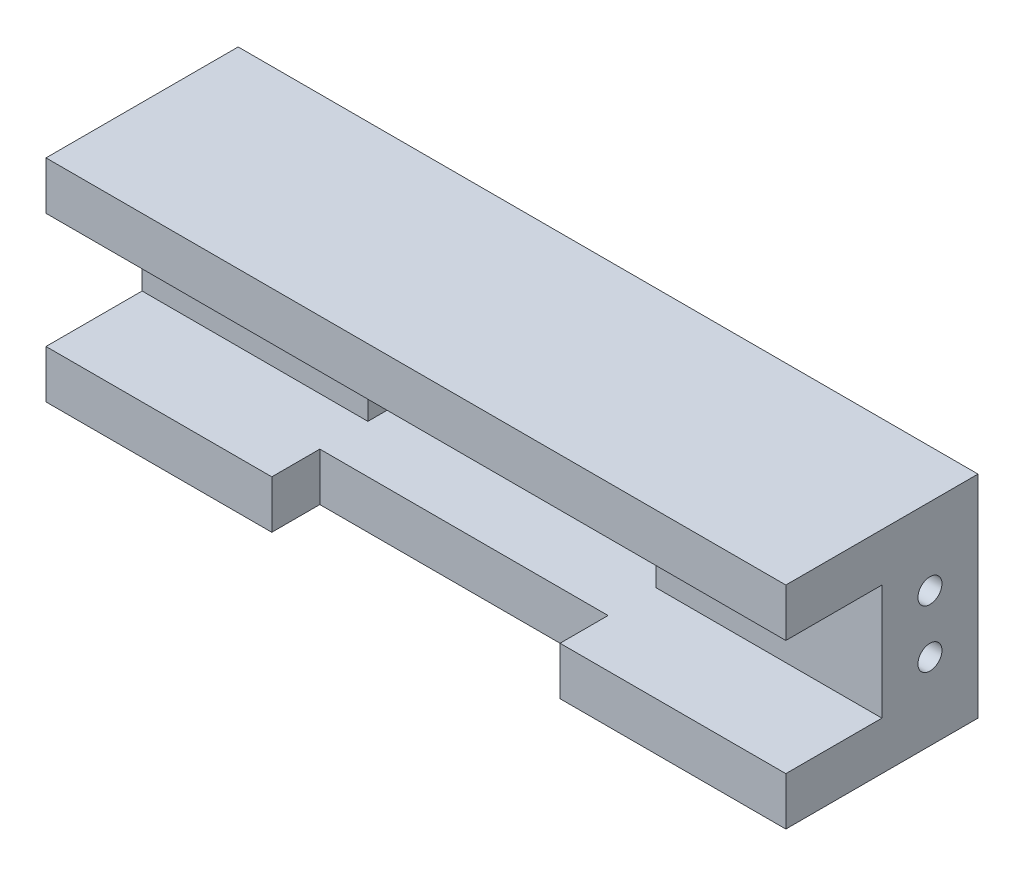
ISO-10303-21;
HEADER;
FILE_DESCRIPTION(('STEP AP214'),'2;1');
FILE_NAME('part.step','',(''),(''),'','','');
FILE_SCHEMA(('AUTOMOTIVE_DESIGN { 1 0 10303 214 1 1 1 1 }'));
ENDSEC;
DATA;
#1=APPLICATION_CONTEXT('core data for automotive mechanical design processes');
#2=APPLICATION_PROTOCOL_DEFINITION('international standard','automotive_design',2000,#1);
#3=PRODUCT_CONTEXT('',#1,'mechanical');
#4=PRODUCT('Part','Part','',(#3));
#5=PRODUCT_RELATED_PRODUCT_CATEGORY('part','',(#4));
#6=PRODUCT_DEFINITION_FORMATION('','',#4);
#7=PRODUCT_DEFINITION_CONTEXT('part definition',#1,'design');
#8=PRODUCT_DEFINITION('design','',#6,#7);
#9=PRODUCT_DEFINITION_SHAPE('','',#8);
#10=(LENGTH_UNIT() NAMED_UNIT(*) SI_UNIT(.MILLI.,.METRE.));
#11=(NAMED_UNIT(*) PLANE_ANGLE_UNIT() SI_UNIT($,.RADIAN.));
#12=(NAMED_UNIT(*) SI_UNIT($,.STERADIAN.) SOLID_ANGLE_UNIT());
#13=UNCERTAINTY_MEASURE_WITH_UNIT(LENGTH_MEASURE(1.E-05),#10,'distance_accuracy_value','');
#14=(GEOMETRIC_REPRESENTATION_CONTEXT(3) GLOBAL_UNCERTAINTY_ASSIGNED_CONTEXT((#13)) GLOBAL_UNIT_ASSIGNED_CONTEXT((#10,
#11,#12)) REPRESENTATION_CONTEXT('',''));
#15=CARTESIAN_POINT('',(0.,0.,0.));
#16=DIRECTION('',(0.,0.,1.));
#17=DIRECTION('',(1.,0.,0.));
#18=AXIS2_PLACEMENT_3D('',#15,#16,#17);
#19=CARTESIAN_POINT('',(0.,0.,0.));
#20=DIRECTION('',(0.,1.,0.));
#21=DIRECTION('',(1.,0.,0.));
#22=AXIS2_PLACEMENT_3D('',#19,#20,#21);
#23=PLANE('',#22);
#24=DIRECTION('',(1.,0.,0.));
#25=VECTOR('',#24,1.);
#26=CARTESIAN_POINT('',(77.,0.,20.));
#27=LINE('',#26,#25);
#28=CARTESIAN_POINT('',(0.,0.,20.));
#29=VERTEX_POINT('',#28);
#30=CARTESIAN_POINT('',(23.5,0.,20.));
#31=VERTEX_POINT('',#30);
#32=EDGE_CURVE('E217',#29,#31,#27,.T.);
#33=ORIENTED_EDGE('',*,*,#32,.T.);
#34=DIRECTION('',(0.,0.,1.));
#35=VECTOR('',#34,1.);
#36=CARTESIAN_POINT('',(23.5,0.,15.));
#37=LINE('',#36,#35);
#38=CARTESIAN_POINT('',(23.5,0.,15.));
#39=VERTEX_POINT('',#38);
#40=EDGE_CURVE('E170',#39,#31,#37,.T.);
#41=ORIENTED_EDGE('',*,*,#40,.F.);
#42=DIRECTION('',(-1.,0.,0.));
#43=VECTOR('',#42,1.);
#44=CARTESIAN_POINT('',(0.,0.,15.));
#45=LINE('',#44,#43);
#46=CARTESIAN_POINT('',(53.5,0.,15.));
#47=VERTEX_POINT('',#46);
#48=EDGE_CURVE('E156',#47,#39,#45,.T.);
#49=ORIENTED_EDGE('',*,*,#48,.F.);
#50=DIRECTION('',(0.,0.,1.));
#51=VECTOR('',#50,1.);
#52=CARTESIAN_POINT('',(53.5,0.,15.));
#53=LINE('',#52,#51);
#54=CARTESIAN_POINT('',(53.5,0.,20.));
#55=VERTEX_POINT('',#54);
#56=EDGE_CURVE('E154',#47,#55,#53,.T.);
#57=ORIENTED_EDGE('',*,*,#56,.T.);
#58=CARTESIAN_POINT('',(77.,0.,20.));
#59=VERTEX_POINT('',#58);
#60=EDGE_CURVE('E216',#55,#59,#27,.T.);
#61=ORIENTED_EDGE('',*,*,#60,.T.);
#62=DIRECTION('',(0.,0.,-1.));
#63=VECTOR('',#62,1.);
#64=CARTESIAN_POINT('',(77.,0.,0.));
#65=LINE('',#64,#63);
#66=CARTESIAN_POINT('',(77.,0.,10.));
#67=VERTEX_POINT('',#66);
#68=EDGE_CURVE('E194',#59,#67,#65,.T.);
#69=ORIENTED_EDGE('',*,*,#68,.T.);
#70=DIRECTION('',(1.,0.,0.));
#71=VECTOR('',#70,1.);
#72=CARTESIAN_POINT('',(0.,0.,10.));
#73=LINE('',#72,#71);
#74=CARTESIAN_POINT('',(53.5,0.,10.));
#75=VERTEX_POINT('',#74);
#76=EDGE_CURVE('E277',#75,#67,#73,.T.);
#77=ORIENTED_EDGE('',*,*,#76,.F.);
#78=DIRECTION('',(0.,0.,-1.));
#79=VECTOR('',#78,1.);
#80=CARTESIAN_POINT('',(53.5,0.,10.));
#81=LINE('',#80,#79);
#82=CARTESIAN_POINT('',(53.5,0.,0.));
#83=VERTEX_POINT('',#82);
#84=EDGE_CURVE('E195',#75,#83,#81,.T.);
#85=ORIENTED_EDGE('',*,*,#84,.T.);
#86=DIRECTION('',(-1.,0.,0.));
#87=VECTOR('',#86,1.);
#88=CARTESIAN_POINT('',(0.,0.,0.));
#89=LINE('',#88,#87);
#90=CARTESIAN_POINT('',(23.5,0.,0.));
#91=VERTEX_POINT('',#90);
#92=EDGE_CURVE('E179',#83,#91,#89,.T.);
#93=ORIENTED_EDGE('',*,*,#92,.T.);
#94=DIRECTION('',(0.,0.,-1.));
#95=VECTOR('',#94,1.);
#96=CARTESIAN_POINT('',(23.5,0.,10.));
#97=LINE('',#96,#95);
#98=CARTESIAN_POINT('',(23.5,0.,10.));
#99=VERTEX_POINT('',#98);
#100=EDGE_CURVE('E192',#99,#91,#97,.T.);
#101=ORIENTED_EDGE('',*,*,#100,.F.);
#102=CARTESIAN_POINT('',(0.,0.,10.));
#103=VERTEX_POINT('',#102);
#104=EDGE_CURVE('E278',#103,#99,#73,.T.);
#105=ORIENTED_EDGE('',*,*,#104,.F.);
#106=DIRECTION('',(0.,0.,1.));
#107=VECTOR('',#106,1.);
#108=CARTESIAN_POINT('',(0.,0.,0.));
#109=LINE('',#108,#107);
#110=EDGE_CURVE('E203',#103,#29,#109,.T.);
#111=ORIENTED_EDGE('',*,*,#110,.T.);
#112=EDGE_LOOP('',(#33,#41,#49,#57,#61,#69,#77,#85,#93,#101,#105,#111));
#113=FACE_BOUND('',#112,.T.);
#114=ADVANCED_FACE('F33',(#113),#23,.T.);
#115=CARTESIAN_POINT('',(77.,-5.,20.));
#116=DIRECTION('',(0.,0.,1.));
#117=DIRECTION('',(1.,0.,0.));
#118=AXIS2_PLACEMENT_3D('',#115,#116,#117);
#119=PLANE('',#118);
#120=DIRECTION('',(1.,0.,0.));
#121=VECTOR('',#120,1.);
#122=CARTESIAN_POINT('',(77.,-5.,20.));
#123=LINE('',#122,#121);
#124=CARTESIAN_POINT('',(0.,-5.,20.));
#125=VERTEX_POINT('',#124);
#126=CARTESIAN_POINT('',(23.5,-5.,20.));
#127=VERTEX_POINT('',#126);
#128=EDGE_CURVE('E204',#125,#127,#123,.T.);
#129=ORIENTED_EDGE('',*,*,#128,.T.);
#130=DIRECTION('',(0.,1.,0.));
#131=VECTOR('',#130,1.);
#132=CARTESIAN_POINT('',(23.5,0.,20.));
#133=LINE('',#132,#131);
#134=EDGE_CURVE('E319',#127,#31,#133,.T.);
#135=ORIENTED_EDGE('',*,*,#134,.T.);
#136=ORIENTED_EDGE('',*,*,#32,.F.);
#137=DIRECTION('',(0.,1.,0.));
#138=VECTOR('',#137,1.);
#139=CARTESIAN_POINT('',(0.,-5.,20.));
#140=LINE('',#139,#138);
#141=EDGE_CURVE('E213',#125,#29,#140,.T.);
#142=ORIENTED_EDGE('',*,*,#141,.F.);
#143=EDGE_LOOP('',(#129,#135,#136,#142));
#144=FACE_BOUND('',#143,.T.);
#145=ADVANCED_FACE('F330',(#144),#119,.T.);
#146=CARTESIAN_POINT('',(0.,-5.,0.));
#147=DIRECTION('',(0.,1.,0.));
#148=DIRECTION('',(1.,0.,0.));
#149=AXIS2_PLACEMENT_3D('',#146,#147,#148);
#150=PLANE('',#149);
#151=DIRECTION('',(0.,0.,1.));
#152=VECTOR('',#151,1.);
#153=CARTESIAN_POINT('',(23.5,-5.,15.));
#154=LINE('',#153,#152);
#155=CARTESIAN_POINT('',(23.5,-5.,15.));
#156=VERTEX_POINT('',#155);
#157=EDGE_CURVE('E168',#156,#127,#154,.T.);
#158=ORIENTED_EDGE('',*,*,#157,.T.);
#159=ORIENTED_EDGE('',*,*,#128,.F.);
#160=DIRECTION('',(0.,0.,1.));
#161=VECTOR('',#160,1.);
#162=CARTESIAN_POINT('',(0.,-5.,0.));
#163=LINE('',#162,#161);
#164=CARTESIAN_POINT('',(0.,-5.,0.));
#165=VERTEX_POINT('',#164);
#166=EDGE_CURVE('E207',#165,#125,#163,.T.);
#167=ORIENTED_EDGE('',*,*,#166,.F.);
#168=DIRECTION('',(-1.,0.,0.));
#169=VECTOR('',#168,1.);
#170=CARTESIAN_POINT('',(77.,-5.,0.));
#171=LINE('',#170,#169);
#172=CARTESIAN_POINT('',(77.,-5.,0.));
#173=VERTEX_POINT('',#172);
#174=EDGE_CURVE('E210',#173,#165,#171,.T.);
#175=ORIENTED_EDGE('',*,*,#174,.F.);
#176=DIRECTION('',(0.,0.,-1.));
#177=VECTOR('',#176,1.);
#178=CARTESIAN_POINT('',(77.,-5.,0.));
#179=LINE('',#178,#177);
#180=CARTESIAN_POINT('',(77.,-5.,20.));
#181=VERTEX_POINT('',#180);
#182=EDGE_CURVE('E200',#181,#173,#179,.T.);
#183=ORIENTED_EDGE('',*,*,#182,.F.);
#184=CARTESIAN_POINT('',(53.5,-5.,20.));
#185=VERTEX_POINT('',#184);
#186=EDGE_CURVE('E167',#185,#181,#123,.T.);
#187=ORIENTED_EDGE('',*,*,#186,.F.);
#188=DIRECTION('',(0.,0.,1.));
#189=VECTOR('',#188,1.);
#190=CARTESIAN_POINT('',(53.5,-5.,15.));
#191=LINE('',#190,#189);
#192=CARTESIAN_POINT('',(53.5,-5.,15.));
#193=VERTEX_POINT('',#192);
#194=EDGE_CURVE('E151',#193,#185,#191,.T.);
#195=ORIENTED_EDGE('',*,*,#194,.F.);
#196=DIRECTION('',(1.,0.,0.));
#197=VECTOR('',#196,1.);
#198=CARTESIAN_POINT('',(0.,-5.,15.));
#199=LINE('',#198,#197);
#200=EDGE_CURVE('E157',#156,#193,#199,.T.);
#201=ORIENTED_EDGE('',*,*,#200,.F.);
#202=EDGE_LOOP('',(#158,#159,#167,#175,#183,#187,#195,#201));
#203=FACE_BOUND('',#202,.T.);
#204=ADVANCED_FACE('F165',(#203),#150,.F.);
#205=CARTESIAN_POINT('',(0.,0.,10.));
#206=DIRECTION('',(0.,0.,-1.));
#207=DIRECTION('',(-1.,0.,0.));
#208=AXIS2_PLACEMENT_3D('',#205,#206,#207);
#209=PLANE('',#208);
#210=DIRECTION('',(0.,-1.,0.));
#211=VECTOR('',#210,1.);
#212=CARTESIAN_POINT('',(23.5,0.,10.));
#213=LINE('',#212,#211);
#214=CARTESIAN_POINT('',(23.5,12.,10.));
#215=VERTEX_POINT('',#214);
#216=EDGE_CURVE('E175',#215,#99,#213,.T.);
#217=ORIENTED_EDGE('',*,*,#216,.F.);
#218=DIRECTION('',(-1.,0.,0.));
#219=VECTOR('',#218,1.);
#220=CARTESIAN_POINT('',(0.,12.,10.));
#221=LINE('',#220,#219);
#222=CARTESIAN_POINT('',(0.,12.,10.));
#223=VERTEX_POINT('',#222);
#224=EDGE_CURVE('E42',#215,#223,#221,.T.);
#225=ORIENTED_EDGE('',*,*,#224,.T.);
#226=DIRECTION('',(0.,-1.,0.));
#227=VECTOR('',#226,1.);
#228=CARTESIAN_POINT('',(0.,0.,10.));
#229=LINE('',#228,#227);
#230=EDGE_CURVE('E274',#223,#103,#229,.T.);
#231=ORIENTED_EDGE('',*,*,#230,.T.);
#232=ORIENTED_EDGE('',*,*,#104,.T.);
#233=EDGE_LOOP('',(#217,#225,#231,#232));
#234=FACE_BOUND('',#233,.T.);
#235=ADVANCED_FACE('F341',(#234),#209,.F.);
#236=CARTESIAN_POINT('',(0.,0.,0.));
#237=DIRECTION('',(0.,0.,-1.));
#238=DIRECTION('',(-1.,0.,0.));
#239=AXIS2_PLACEMENT_3D('',#236,#237,#238);
#240=PLANE('',#239);
#241=DIRECTION('',(0.,-1.,0.));
#242=VECTOR('',#241,1.);
#243=CARTESIAN_POINT('',(0.,0.,0.));
#244=LINE('',#243,#242);
#245=CARTESIAN_POINT('',(0.,17.,0.));
#246=VERTEX_POINT('',#245);
#247=EDGE_CURVE('E265',#246,#165,#244,.T.);
#248=ORIENTED_EDGE('',*,*,#247,.F.);
#249=DIRECTION('',(-1.,0.,0.));
#250=VECTOR('',#249,1.);
#251=CARTESIAN_POINT('',(77.,17.,0.));
#252=LINE('',#251,#250);
#253=CARTESIAN_POINT('',(77.,17.,0.));
#254=VERTEX_POINT('',#253);
#255=EDGE_CURVE('E230',#254,#246,#252,.T.);
#256=ORIENTED_EDGE('',*,*,#255,.F.);
#257=DIRECTION('',(0.,1.,0.));
#258=VECTOR('',#257,1.);
#259=CARTESIAN_POINT('',(77.,0.,0.));
#260=LINE('',#259,#258);
#261=EDGE_CURVE('E37',#173,#254,#260,.T.);
#262=ORIENTED_EDGE('',*,*,#261,.F.);
#263=ORIENTED_EDGE('',*,*,#174,.T.);
#264=EDGE_LOOP('',(#248,#256,#262,#263));
#265=FACE_BOUND('',#264,.T.);
#266=DIRECTION('',(-1.,0.,0.));
#267=VECTOR('',#266,1.);
#268=CARTESIAN_POINT('',(0.,12.,0.));
#269=LINE('',#268,#267);
#270=CARTESIAN_POINT('',(53.5,12.,0.));
#271=VERTEX_POINT('',#270);
#272=CARTESIAN_POINT('',(23.5,12.,0.));
#273=VERTEX_POINT('',#272);
#274=EDGE_CURVE('E184',#271,#273,#269,.T.);
#275=ORIENTED_EDGE('',*,*,#274,.T.);
#276=DIRECTION('',(0.,-1.,0.));
#277=VECTOR('',#276,1.);
#278=CARTESIAN_POINT('',(23.5,0.,0.));
#279=LINE('',#278,#277);
#280=EDGE_CURVE('E58',#273,#91,#279,.T.);
#281=ORIENTED_EDGE('',*,*,#280,.T.);
#282=ORIENTED_EDGE('',*,*,#92,.F.);
#283=DIRECTION('',(0.,-1.,0.));
#284=VECTOR('',#283,1.);
#285=CARTESIAN_POINT('',(53.5,0.,0.));
#286=LINE('',#285,#284);
#287=EDGE_CURVE('E187',#271,#83,#286,.T.);
#288=ORIENTED_EDGE('',*,*,#287,.F.);
#289=EDGE_LOOP('',(#275,#281,#282,#288));
#290=FACE_BOUND('',#289,.T.);
#291=ADVANCED_FACE('F293',(#265,#290),#240,.T.);
#292=CARTESIAN_POINT('',(0.,0.,10.));
#293=DIRECTION('',(1.,0.,0.));
#294=DIRECTION('',(0.,0.,-1.));
#295=AXIS2_PLACEMENT_3D('',#292,#293,#294);
#296=PLANE('',#295);
#297=CARTESIAN_POINT('',(0.,3.,5.));
#298=DIRECTION('',(1.,0.,0.));
#299=DIRECTION('',(0.,0.,-1.));
#300=AXIS2_PLACEMENT_3D('',#297,#298,#299);
#301=CIRCLE('',#300,1.25);
#302=CARTESIAN_POINT('',(0.,3.,3.75));
#303=VERTEX_POINT('',#302);
#304=EDGE_CURVE('E254',#303,#303,#301,.T.);
#305=ORIENTED_EDGE('',*,*,#304,.T.);
#306=EDGE_LOOP('',(#305));
#307=FACE_BOUND('',#306,.T.);
#308=CARTESIAN_POINT('',(0.,9.,5.));
#309=DIRECTION('',(1.,0.,0.));
#310=DIRECTION('',(0.,0.,-1.));
#311=AXIS2_PLACEMENT_3D('',#308,#309,#310);
#312=CIRCLE('',#311,1.25);
#313=CARTESIAN_POINT('',(0.,9.,3.75));
#314=VERTEX_POINT('',#313);
#315=EDGE_CURVE('E249',#314,#314,#312,.T.);
#316=ORIENTED_EDGE('',*,*,#315,.T.);
#317=EDGE_LOOP('',(#316));
#318=FACE_BOUND('',#317,.T.);
#319=ORIENTED_EDGE('',*,*,#247,.T.);
#320=ORIENTED_EDGE('',*,*,#166,.T.);
#321=ORIENTED_EDGE('',*,*,#141,.T.);
#322=ORIENTED_EDGE('',*,*,#110,.F.);
#323=ORIENTED_EDGE('',*,*,#230,.F.);
#324=DIRECTION('',(0.,0.,1.));
#325=VECTOR('',#324,1.);
#326=CARTESIAN_POINT('',(0.,12.,0.));
#327=LINE('',#326,#325);
#328=CARTESIAN_POINT('',(0.,12.,20.));
#329=VERTEX_POINT('',#328);
#330=EDGE_CURVE('E241',#223,#329,#327,.T.);
#331=ORIENTED_EDGE('',*,*,#330,.T.);
#332=DIRECTION('',(0.,-1.,0.));
#333=VECTOR('',#332,1.);
#334=CARTESIAN_POINT('',(0.,17.,20.));
#335=LINE('',#334,#333);
#336=CARTESIAN_POINT('',(0.,17.,20.));
#337=VERTEX_POINT('',#336);
#338=EDGE_CURVE('E246',#337,#329,#335,.T.);
#339=ORIENTED_EDGE('',*,*,#338,.F.);
#340=DIRECTION('',(0.,0.,1.));
#341=VECTOR('',#340,1.);
#342=CARTESIAN_POINT('',(0.,17.,0.));
#343=LINE('',#342,#341);
#344=EDGE_CURVE('E234',#246,#337,#343,.T.);
#345=ORIENTED_EDGE('',*,*,#344,.F.);
#346=EDGE_LOOP('',(#319,#320,#321,#322,#323,#331,#339,#345));
#347=FACE_BOUND('',#346,.T.);
#348=ADVANCED_FACE('F35',(#307,#318,#347),#296,.F.);
#349=CARTESIAN_POINT('',(77.,0.,10.));
#350=DIRECTION('',(-1.,0.,0.));
#351=DIRECTION('',(0.,0.,1.));
#352=AXIS2_PLACEMENT_3D('',#349,#350,#351);
#353=PLANE('',#352);
#354=CARTESIAN_POINT('',(77.,3.,5.));
#355=DIRECTION('',(1.,0.,0.));
#356=DIRECTION('',(0.,0.,-1.));
#357=AXIS2_PLACEMENT_3D('',#354,#355,#356);
#358=CIRCLE('',#357,1.25);
#359=CARTESIAN_POINT('',(77.,3.,3.75));
#360=VERTEX_POINT('',#359);
#361=EDGE_CURVE('E266',#360,#360,#358,.T.);
#362=ORIENTED_EDGE('',*,*,#361,.F.);
#363=EDGE_LOOP('',(#362));
#364=FACE_BOUND('',#363,.T.);
#365=CARTESIAN_POINT('',(77.,9.,5.));
#366=DIRECTION('',(1.,0.,0.));
#367=DIRECTION('',(0.,0.,-1.));
#368=AXIS2_PLACEMENT_3D('',#365,#366,#367);
#369=CIRCLE('',#368,1.25);
#370=CARTESIAN_POINT('',(77.,9.,3.75));
#371=VERTEX_POINT('',#370);
#372=EDGE_CURVE('E269',#371,#371,#369,.T.);
#373=ORIENTED_EDGE('',*,*,#372,.F.);
#374=EDGE_LOOP('',(#373));
#375=FACE_BOUND('',#374,.T.);
#376=ORIENTED_EDGE('',*,*,#261,.T.);
#377=DIRECTION('',(0.,0.,-1.));
#378=VECTOR('',#377,1.);
#379=CARTESIAN_POINT('',(77.,17.,0.));
#380=LINE('',#379,#378);
#381=CARTESIAN_POINT('',(77.,17.,20.));
#382=VERTEX_POINT('',#381);
#383=EDGE_CURVE('E227',#382,#254,#380,.T.);
#384=ORIENTED_EDGE('',*,*,#383,.F.);
#385=DIRECTION('',(0.,-1.,0.));
#386=VECTOR('',#385,1.);
#387=CARTESIAN_POINT('',(77.,17.,20.));
#388=LINE('',#387,#386);
#389=CARTESIAN_POINT('',(77.,12.,20.));
#390=VERTEX_POINT('',#389);
#391=EDGE_CURVE('E238',#382,#390,#388,.T.);
#392=ORIENTED_EDGE('',*,*,#391,.T.);
#393=DIRECTION('',(0.,0.,-1.));
#394=VECTOR('',#393,1.);
#395=CARTESIAN_POINT('',(77.,12.,0.));
#396=LINE('',#395,#394);
#397=CARTESIAN_POINT('',(77.,12.,10.));
#398=VERTEX_POINT('',#397);
#399=EDGE_CURVE('E226',#390,#398,#396,.T.);
#400=ORIENTED_EDGE('',*,*,#399,.T.);
#401=DIRECTION('',(0.,1.,0.));
#402=VECTOR('',#401,1.);
#403=CARTESIAN_POINT('',(77.,0.,10.));
#404=LINE('',#403,#402);
#405=EDGE_CURVE('E281',#67,#398,#404,.T.);
#406=ORIENTED_EDGE('',*,*,#405,.F.);
#407=ORIENTED_EDGE('',*,*,#68,.F.);
#408=DIRECTION('',(0.,1.,0.));
#409=VECTOR('',#408,1.);
#410=CARTESIAN_POINT('',(77.,-5.,20.));
#411=LINE('',#410,#409);
#412=EDGE_CURVE('E223',#181,#59,#411,.T.);
#413=ORIENTED_EDGE('',*,*,#412,.F.);
#414=ORIENTED_EDGE('',*,*,#182,.T.);
#415=EDGE_LOOP('',(#376,#384,#392,#400,#406,#407,#413,#414));
#416=FACE_BOUND('',#415,.T.);
#417=ADVANCED_FACE('F289',(#364,#375,#416),#353,.F.);
#418=CARTESIAN_POINT('',(53.5,12.,10.));
#419=VERTEX_POINT('',#418);
#420=EDGE_CURVE('E11',#398,#419,#221,.T.);
#421=ORIENTED_EDGE('',*,*,#420,.T.);
#422=DIRECTION('',(0.,-1.,0.));
#423=VECTOR('',#422,1.);
#424=CARTESIAN_POINT('',(53.5,0.,10.));
#425=LINE('',#424,#423);
#426=EDGE_CURVE('E178',#419,#75,#425,.T.);
#427=ORIENTED_EDGE('',*,*,#426,.T.);
#428=ORIENTED_EDGE('',*,*,#76,.T.);
#429=ORIENTED_EDGE('',*,*,#405,.T.);
#430=EDGE_LOOP('',(#421,#427,#428,#429));
#431=FACE_BOUND('',#430,.T.);
#432=ADVANCED_FACE('F311',(#431),#209,.F.);
#433=CARTESIAN_POINT('',(65.,9.,5.));
#434=DIRECTION('',(1.,0.,0.));
#435=DIRECTION('',(0.,0.,-1.));
#436=AXIS2_PLACEMENT_3D('',#433,#434,#435);
#437=CYLINDRICAL_SURFACE('',#436,1.25);
#438=CARTESIAN_POINT('',(65.,9.,5.));
#439=DIRECTION('',(1.,0.,0.));
#440=DIRECTION('',(0.,0.,-1.));
#441=AXIS2_PLACEMENT_3D('',#438,#439,#440);
#442=CIRCLE('',#441,1.25);
#443=CARTESIAN_POINT('',(65.,9.,3.75));
#444=VERTEX_POINT('',#443);
#445=EDGE_CURVE('E253',#444,#444,#442,.T.);
#446=ORIENTED_EDGE('',*,*,#445,.F.);
#447=EDGE_LOOP('',(#446));
#448=FACE_BOUND('',#447,.T.);
#449=ORIENTED_EDGE('',*,*,#372,.T.);
#450=EDGE_LOOP('',(#449));
#451=FACE_BOUND('',#450,.T.);
#452=ADVANCED_FACE('F387',(#448,#451),#437,.F.);
#453=CARTESIAN_POINT('',(65.,9.,5.));
#454=DIRECTION('',(1.,0.,0.));
#455=DIRECTION('',(0.,0.,-1.));
#456=AXIS2_PLACEMENT_3D('',#453,#454,#455);
#457=PLANE('',#456);
#458=ORIENTED_EDGE('',*,*,#445,.T.);
#459=EDGE_LOOP('',(#458));
#460=FACE_BOUND('',#459,.T.);
#461=ADVANCED_FACE('F385',(#460),#457,.T.);
#462=CARTESIAN_POINT('',(65.,3.,5.));
#463=DIRECTION('',(1.,0.,0.));
#464=DIRECTION('',(0.,0.,-1.));
#465=AXIS2_PLACEMENT_3D('',#462,#463,#464);
#466=CYLINDRICAL_SURFACE('',#465,1.25);
#467=CARTESIAN_POINT('',(65.,3.,5.));
#468=DIRECTION('',(1.,0.,0.));
#469=DIRECTION('',(0.,0.,-1.));
#470=AXIS2_PLACEMENT_3D('',#467,#468,#469);
#471=CIRCLE('',#470,1.25);
#472=CARTESIAN_POINT('',(65.,3.,3.75));
#473=VERTEX_POINT('',#472);
#474=EDGE_CURVE('E262',#473,#473,#471,.T.);
#475=ORIENTED_EDGE('',*,*,#474,.F.);
#476=EDGE_LOOP('',(#475));
#477=FACE_BOUND('',#476,.T.);
#478=ORIENTED_EDGE('',*,*,#361,.T.);
#479=EDGE_LOOP('',(#478));
#480=FACE_BOUND('',#479,.T.);
#481=ADVANCED_FACE('F381',(#477,#480),#466,.F.);
#482=CARTESIAN_POINT('',(65.,3.,5.));
#483=DIRECTION('',(1.,0.,0.));
#484=DIRECTION('',(0.,0.,-1.));
#485=AXIS2_PLACEMENT_3D('',#482,#483,#484);
#486=PLANE('',#485);
#487=ORIENTED_EDGE('',*,*,#474,.T.);
#488=EDGE_LOOP('',(#487));
#489=FACE_BOUND('',#488,.T.);
#490=ADVANCED_FACE('F377',(#489),#486,.T.);
#491=CARTESIAN_POINT('',(12.,9.,5.));
#492=DIRECTION('',(-1.,0.,0.));
#493=DIRECTION('',(0.,0.,1.));
#494=AXIS2_PLACEMENT_3D('',#491,#492,#493);
#495=CYLINDRICAL_SURFACE('',#494,1.25);
#496=CARTESIAN_POINT('',(12.,9.,5.));
#497=DIRECTION('',(1.,0.,0.));
#498=DIRECTION('',(0.,0.,-1.));
#499=AXIS2_PLACEMENT_3D('',#496,#497,#498);
#500=CIRCLE('',#499,1.25);
#501=CARTESIAN_POINT('',(12.,9.,3.75));
#502=VERTEX_POINT('',#501);
#503=EDGE_CURVE('E257',#502,#502,#500,.T.);
#504=ORIENTED_EDGE('',*,*,#503,.T.);
#505=EDGE_LOOP('',(#504));
#506=FACE_BOUND('',#505,.T.);
#507=ORIENTED_EDGE('',*,*,#315,.F.);
#508=EDGE_LOOP('',(#507));
#509=FACE_BOUND('',#508,.T.);
#510=ADVANCED_FACE('F373',(#506,#509),#495,.F.);
#511=CARTESIAN_POINT('',(12.,9.,5.));
#512=DIRECTION('',(-1.,0.,0.));
#513=DIRECTION('',(0.,0.,-1.));
#514=AXIS2_PLACEMENT_3D('',#511,#512,#513);
#515=PLANE('',#514);
#516=ORIENTED_EDGE('',*,*,#503,.F.);
#517=EDGE_LOOP('',(#516));
#518=FACE_BOUND('',#517,.T.);
#519=ADVANCED_FACE('F369',(#518),#515,.T.);
#520=CARTESIAN_POINT('',(12.,3.,5.));
#521=DIRECTION('',(-1.,0.,0.));
#522=DIRECTION('',(0.,0.,1.));
#523=AXIS2_PLACEMENT_3D('',#520,#521,#522);
#524=CYLINDRICAL_SURFACE('',#523,1.25);
#525=CARTESIAN_POINT('',(12.,3.,5.));
#526=DIRECTION('',(1.,0.,0.));
#527=DIRECTION('',(0.,0.,-1.));
#528=AXIS2_PLACEMENT_3D('',#525,#526,#527);
#529=CIRCLE('',#528,1.25);
#530=CARTESIAN_POINT('',(12.,3.,3.75));
#531=VERTEX_POINT('',#530);
#532=EDGE_CURVE('E250',#531,#531,#529,.T.);
#533=ORIENTED_EDGE('',*,*,#532,.T.);
#534=EDGE_LOOP('',(#533));
#535=FACE_BOUND('',#534,.T.);
#536=ORIENTED_EDGE('',*,*,#304,.F.);
#537=EDGE_LOOP('',(#536));
#538=FACE_BOUND('',#537,.T.);
#539=ADVANCED_FACE('F365',(#535,#538),#524,.F.);
#540=CARTESIAN_POINT('',(12.,3.,5.));
#541=DIRECTION('',(-1.,0.,0.));
#542=DIRECTION('',(0.,0.,-1.));
#543=AXIS2_PLACEMENT_3D('',#540,#541,#542);
#544=PLANE('',#543);
#545=ORIENTED_EDGE('',*,*,#532,.F.);
#546=EDGE_LOOP('',(#545));
#547=FACE_BOUND('',#546,.T.);
#548=ADVANCED_FACE('F360',(#547),#544,.T.);
#549=CARTESIAN_POINT('',(0.,12.,0.));
#550=DIRECTION('',(0.,-1.,0.));
#551=DIRECTION('',(1.,0.,0.));
#552=AXIS2_PLACEMENT_3D('',#549,#550,#551);
#553=PLANE('',#552);
#554=ORIENTED_EDGE('',*,*,#420,.F.);
#555=ORIENTED_EDGE('',*,*,#399,.F.);
#556=DIRECTION('',(1.,0.,0.));
#557=VECTOR('',#556,1.);
#558=CARTESIAN_POINT('',(77.,12.,20.));
#559=LINE('',#558,#557);
#560=EDGE_CURVE('E231',#329,#390,#559,.T.);
#561=ORIENTED_EDGE('',*,*,#560,.F.);
#562=ORIENTED_EDGE('',*,*,#330,.F.);
#563=ORIENTED_EDGE('',*,*,#224,.F.);
#564=DIRECTION('',(0.,0.,-1.));
#565=VECTOR('',#564,1.);
#566=CARTESIAN_POINT('',(23.5,12.,10.));
#567=LINE('',#566,#565);
#568=EDGE_CURVE('E182',#215,#273,#567,.T.);
#569=ORIENTED_EDGE('',*,*,#568,.T.);
#570=ORIENTED_EDGE('',*,*,#274,.F.);
#571=DIRECTION('',(0.,0.,-1.));
#572=VECTOR('',#571,1.);
#573=CARTESIAN_POINT('',(53.5,12.,10.));
#574=LINE('',#573,#572);
#575=EDGE_CURVE('E197',#419,#271,#574,.T.);
#576=ORIENTED_EDGE('',*,*,#575,.F.);
#577=EDGE_LOOP('',(#554,#555,#561,#562,#563,#569,#570,#576));
#578=FACE_BOUND('',#577,.T.);
#579=ADVANCED_FACE('F306',(#578),#553,.T.);
#580=CARTESIAN_POINT('',(77.,17.,20.));
#581=DIRECTION('',(0.,0.,-1.));
#582=DIRECTION('',(-1.,0.,0.));
#583=AXIS2_PLACEMENT_3D('',#580,#581,#582);
#584=PLANE('',#583);
#585=ORIENTED_EDGE('',*,*,#560,.T.);
#586=ORIENTED_EDGE('',*,*,#391,.F.);
#587=DIRECTION('',(1.,0.,0.));
#588=VECTOR('',#587,1.);
#589=CARTESIAN_POINT('',(77.,17.,20.));
#590=LINE('',#589,#588);
#591=EDGE_CURVE('E236',#337,#382,#590,.T.);
#592=ORIENTED_EDGE('',*,*,#591,.F.);
#593=ORIENTED_EDGE('',*,*,#338,.T.);
#594=EDGE_LOOP('',(#585,#586,#592,#593));
#595=FACE_BOUND('',#594,.T.);
#596=ADVANCED_FACE('F301',(#595),#584,.F.);
#597=CARTESIAN_POINT('',(0.,17.,0.));
#598=DIRECTION('',(0.,-1.,0.));
#599=DIRECTION('',(1.,0.,0.));
#600=AXIS2_PLACEMENT_3D('',#597,#598,#599);
#601=PLANE('',#600);
#602=ORIENTED_EDGE('',*,*,#383,.T.);
#603=ORIENTED_EDGE('',*,*,#255,.T.);
#604=ORIENTED_EDGE('',*,*,#344,.T.);
#605=ORIENTED_EDGE('',*,*,#591,.T.);
#606=EDGE_LOOP('',(#602,#603,#604,#605));
#607=FACE_BOUND('',#606,.T.);
#608=ADVANCED_FACE('F296',(#607),#601,.F.);
#609=DIRECTION('',(0.,1.,0.));
#610=VECTOR('',#609,1.);
#611=CARTESIAN_POINT('',(53.5,0.,20.));
#612=LINE('',#611,#610);
#613=EDGE_CURVE('E318',#185,#55,#612,.T.);
#614=ORIENTED_EDGE('',*,*,#613,.F.);
#615=ORIENTED_EDGE('',*,*,#186,.T.);
#616=ORIENTED_EDGE('',*,*,#412,.T.);
#617=ORIENTED_EDGE('',*,*,#60,.F.);
#618=EDGE_LOOP('',(#614,#615,#616,#617));
#619=FACE_BOUND('',#618,.T.);
#620=ADVANCED_FACE('F317',(#619),#119,.T.);
#621=CARTESIAN_POINT('',(23.5,0.,10.));
#622=DIRECTION('',(1.,0.,0.));
#623=DIRECTION('',(0.,0.,-1.));
#624=AXIS2_PLACEMENT_3D('',#621,#622,#623);
#625=PLANE('',#624);
#626=ORIENTED_EDGE('',*,*,#280,.F.);
#627=ORIENTED_EDGE('',*,*,#568,.F.);
#628=ORIENTED_EDGE('',*,*,#216,.T.);
#629=ORIENTED_EDGE('',*,*,#100,.T.);
#630=EDGE_LOOP('',(#626,#627,#628,#629));
#631=FACE_BOUND('',#630,.T.);
#632=ADVANCED_FACE('F355',(#631),#625,.T.);
#633=CARTESIAN_POINT('',(53.5,0.,10.));
#634=DIRECTION('',(1.,0.,0.));
#635=DIRECTION('',(0.,0.,-1.));
#636=AXIS2_PLACEMENT_3D('',#633,#634,#635);
#637=PLANE('',#636);
#638=ORIENTED_EDGE('',*,*,#287,.T.);
#639=ORIENTED_EDGE('',*,*,#84,.F.);
#640=ORIENTED_EDGE('',*,*,#426,.F.);
#641=ORIENTED_EDGE('',*,*,#575,.T.);
#642=EDGE_LOOP('',(#638,#639,#640,#641));
#643=FACE_BOUND('',#642,.T.);
#644=ADVANCED_FACE('F409',(#643),#637,.F.);
#645=CARTESIAN_POINT('',(23.5,0.,15.));
#646=DIRECTION('',(1.,0.,0.));
#647=DIRECTION('',(0.,0.,-1.));
#648=AXIS2_PLACEMENT_3D('',#645,#646,#647);
#649=PLANE('',#648);
#650=ORIENTED_EDGE('',*,*,#134,.F.);
#651=ORIENTED_EDGE('',*,*,#157,.F.);
#652=DIRECTION('',(0.,1.,0.));
#653=VECTOR('',#652,1.);
#654=CARTESIAN_POINT('',(23.5,0.,15.));
#655=LINE('',#654,#653);
#656=EDGE_CURVE('E50',#156,#39,#655,.T.);
#657=ORIENTED_EDGE('',*,*,#656,.T.);
#658=ORIENTED_EDGE('',*,*,#40,.T.);
#659=EDGE_LOOP('',(#650,#651,#657,#658));
#660=FACE_BOUND('',#659,.T.);
#661=ADVANCED_FACE('F327',(#660),#649,.T.);
#662=CARTESIAN_POINT('',(53.5,0.,15.));
#663=DIRECTION('',(1.,0.,0.));
#664=DIRECTION('',(0.,0.,-1.));
#665=AXIS2_PLACEMENT_3D('',#662,#663,#664);
#666=PLANE('',#665);
#667=ORIENTED_EDGE('',*,*,#613,.T.);
#668=ORIENTED_EDGE('',*,*,#56,.F.);
#669=DIRECTION('',(0.,1.,0.));
#670=VECTOR('',#669,1.);
#671=CARTESIAN_POINT('',(53.5,0.,15.));
#672=LINE('',#671,#670);
#673=EDGE_CURVE('E148',#193,#47,#672,.T.);
#674=ORIENTED_EDGE('',*,*,#673,.F.);
#675=ORIENTED_EDGE('',*,*,#194,.T.);
#676=EDGE_LOOP('',(#667,#668,#674,#675));
#677=FACE_BOUND('',#676,.T.);
#678=ADVANCED_FACE('F149',(#677),#666,.F.);
#679=CARTESIAN_POINT('',(0.,0.,15.));
#680=DIRECTION('',(0.,0.,1.));
#681=DIRECTION('',(1.,0.,0.));
#682=AXIS2_PLACEMENT_3D('',#679,#680,#681);
#683=PLANE('',#682);
#684=ORIENTED_EDGE('',*,*,#656,.F.);
#685=ORIENTED_EDGE('',*,*,#200,.T.);
#686=ORIENTED_EDGE('',*,*,#673,.T.);
#687=ORIENTED_EDGE('',*,*,#48,.T.);
#688=EDGE_LOOP('',(#684,#685,#686,#687));
#689=FACE_BOUND('',#688,.T.);
#690=ADVANCED_FACE('F160',(#689),#683,.T.);
#691=CLOSED_SHELL('',(#114,#145,#204,#235,#291,#348,#417,#432,#452,#461,#481,#490,#510,#519,
#539,#548,#579,#596,#608,#620,#632,#644,#661,#678,#690));
#692=MANIFOLD_SOLID_BREP('B2',#691);
#693=ADVANCED_BREP_SHAPE_REPRESENTATION('',(#18,#692),#14);
#694=SHAPE_DEFINITION_REPRESENTATION(#9,#693);
ENDSEC;
END-ISO-10303-21;
